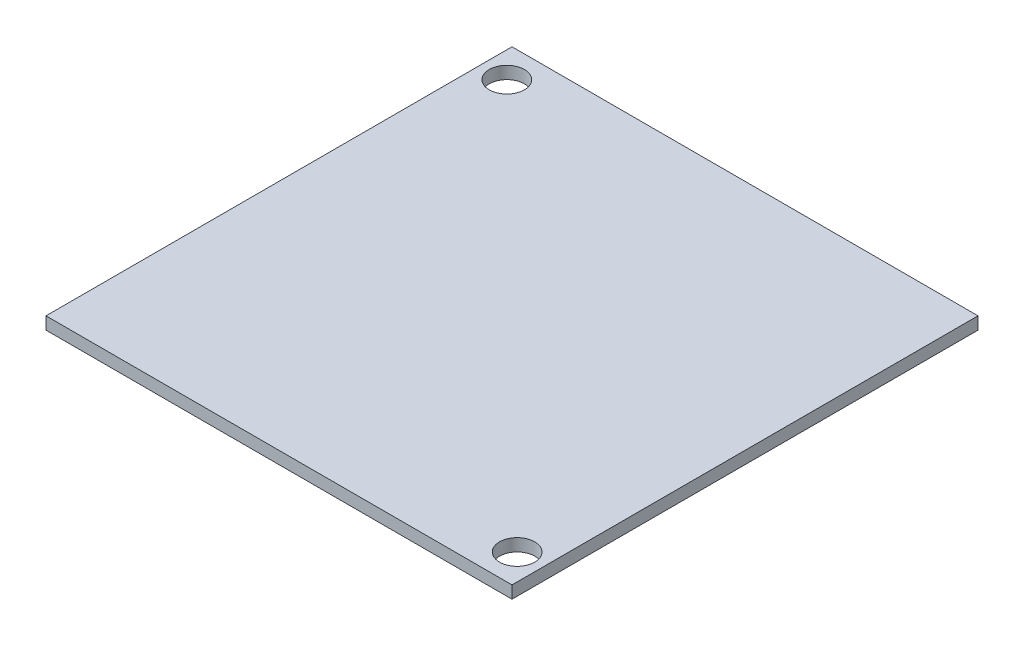
ISO-10303-21;
HEADER;
FILE_DESCRIPTION(('STEP AP214'),'2;1');
FILE_NAME('part.step','',(''),(''),'','','');
FILE_SCHEMA(('AUTOMOTIVE_DESIGN { 1 0 10303 214 1 1 1 1 }'));
ENDSEC;
DATA;
#1=APPLICATION_CONTEXT('core data for automotive mechanical design processes');
#2=APPLICATION_PROTOCOL_DEFINITION('international standard','automotive_design',2000,#1);
#3=PRODUCT_CONTEXT('',#1,'mechanical');
#4=PRODUCT('Part','Part','',(#3));
#5=PRODUCT_RELATED_PRODUCT_CATEGORY('part','',(#4));
#6=PRODUCT_DEFINITION_FORMATION('','',#4);
#7=PRODUCT_DEFINITION_CONTEXT('part definition',#1,'design');
#8=PRODUCT_DEFINITION('design','',#6,#7);
#9=PRODUCT_DEFINITION_SHAPE('','',#8);
#10=(LENGTH_UNIT() NAMED_UNIT(*) SI_UNIT(.MILLI.,.METRE.));
#11=(NAMED_UNIT(*) PLANE_ANGLE_UNIT() SI_UNIT($,.RADIAN.));
#12=(NAMED_UNIT(*) SI_UNIT($,.STERADIAN.) SOLID_ANGLE_UNIT());
#13=UNCERTAINTY_MEASURE_WITH_UNIT(LENGTH_MEASURE(1.E-05),#10,'distance_accuracy_value','');
#14=(GEOMETRIC_REPRESENTATION_CONTEXT(3) GLOBAL_UNCERTAINTY_ASSIGNED_CONTEXT((#13)) GLOBAL_UNIT_ASSIGNED_CONTEXT((#10,
#11,#12)) REPRESENTATION_CONTEXT('',''));
#15=CARTESIAN_POINT('',(0.,0.,0.));
#16=DIRECTION('',(0.,0.,1.));
#17=DIRECTION('',(1.,0.,0.));
#18=AXIS2_PLACEMENT_3D('',#15,#16,#17);
#19=CARTESIAN_POINT('',(-24.7774917250496,1.2,-1.35864833937372));
#20=DIRECTION('',(1.,0.,0.));
#21=DIRECTION('',(0.,0.,-1.));
#22=AXIS2_PLACEMENT_3D('',#19,#20,#21);
#23=PLANE('',#22);
#24=DIRECTION('',(0.,0.,1.));
#25=VECTOR('',#24,1.);
#26=CARTESIAN_POINT('',(-24.7774917250496,0.,-1.35864833937372));
#27=LINE('',#26,#25);
#28=CARTESIAN_POINT('',(-24.7774917250496,0.,-1.35864833937372));
#29=VERTEX_POINT('',#28);
#30=CARTESIAN_POINT('',(-24.7774917250496,0.,43.6413516606263));
#31=VERTEX_POINT('',#30);
#32=EDGE_CURVE('E96',#29,#31,#27,.T.);
#33=ORIENTED_EDGE('',*,*,#32,.T.);
#34=DIRECTION('',(0.,-1.,0.));
#35=VECTOR('',#34,1.);
#36=CARTESIAN_POINT('',(-24.7774917250496,1.2,43.6413516606263));
#37=LINE('',#36,#35);
#38=CARTESIAN_POINT('',(-24.7774917250496,1.2,43.6413516606263));
#39=VERTEX_POINT('',#38);
#40=EDGE_CURVE('E11',#39,#31,#37,.T.);
#41=ORIENTED_EDGE('',*,*,#40,.F.);
#42=DIRECTION('',(0.,0.,1.));
#43=VECTOR('',#42,1.);
#44=CARTESIAN_POINT('',(-24.7774917250496,1.2,-1.35864833937372));
#45=LINE('',#44,#43);
#46=CARTESIAN_POINT('',(-24.7774917250496,1.2,-1.35864833937372));
#47=VERTEX_POINT('',#46);
#48=EDGE_CURVE('E84',#47,#39,#45,.T.);
#49=ORIENTED_EDGE('',*,*,#48,.F.);
#50=DIRECTION('',(0.,-1.,0.));
#51=VECTOR('',#50,1.);
#52=CARTESIAN_POINT('',(-24.7774917250496,1.2,-1.35864833937372));
#53=LINE('',#52,#51);
#54=EDGE_CURVE('E92',#47,#29,#53,.T.);
#55=ORIENTED_EDGE('',*,*,#54,.T.);
#56=EDGE_LOOP('',(#33,#41,#49,#55));
#57=FACE_BOUND('',#56,.T.);
#58=ADVANCED_FACE('F33',(#57),#23,.F.);
#59=CARTESIAN_POINT('',(-24.7774917250496,1.2,43.6413516606263));
#60=DIRECTION('',(0.,0.,-1.));
#61=DIRECTION('',(-1.,0.,0.));
#62=AXIS2_PLACEMENT_3D('',#59,#60,#61);
#63=PLANE('',#62);
#64=DIRECTION('',(1.,0.,0.));
#65=VECTOR('',#64,1.);
#66=CARTESIAN_POINT('',(-24.7774917250496,0.,43.6413516606263));
#67=LINE('',#66,#65);
#68=CARTESIAN_POINT('',(20.2225082749504,0.,43.6413516606263));
#69=VERTEX_POINT('',#68);
#70=EDGE_CURVE('E88',#31,#69,#67,.T.);
#71=ORIENTED_EDGE('',*,*,#70,.T.);
#72=DIRECTION('',(0.,-1.,0.));
#73=VECTOR('',#72,1.);
#74=CARTESIAN_POINT('',(20.2225082749504,1.2,43.6413516606263));
#75=LINE('',#74,#73);
#76=CARTESIAN_POINT('',(20.2225082749504,1.2,43.6413516606263));
#77=VERTEX_POINT('',#76);
#78=EDGE_CURVE('E41',#77,#69,#75,.T.);
#79=ORIENTED_EDGE('',*,*,#78,.F.);
#80=DIRECTION('',(1.,0.,0.));
#81=VECTOR('',#80,1.);
#82=CARTESIAN_POINT('',(-24.7774917250496,1.2,43.6413516606263));
#83=LINE('',#82,#81);
#84=EDGE_CURVE('E79',#39,#77,#83,.T.);
#85=ORIENTED_EDGE('',*,*,#84,.F.);
#86=ORIENTED_EDGE('',*,*,#40,.T.);
#87=EDGE_LOOP('',(#71,#79,#85,#86));
#88=FACE_BOUND('',#87,.T.);
#89=ADVANCED_FACE('F87',(#88),#63,.F.);
#90=CARTESIAN_POINT('',(20.2225082749504,1.2,-1.35864833937372));
#91=DIRECTION('',(-1.,0.,0.));
#92=DIRECTION('',(0.,0.,1.));
#93=AXIS2_PLACEMENT_3D('',#90,#91,#92);
#94=PLANE('',#93);
#95=DIRECTION('',(0.,0.,-1.));
#96=VECTOR('',#95,1.);
#97=CARTESIAN_POINT('',(20.2225082749504,0.,-1.35864833937372));
#98=LINE('',#97,#96);
#99=CARTESIAN_POINT('',(20.2225082749504,0.,-1.35864833937372));
#100=VERTEX_POINT('',#99);
#101=EDGE_CURVE('E66',#69,#100,#98,.T.);
#102=ORIENTED_EDGE('',*,*,#101,.T.);
#103=DIRECTION('',(0.,-1.,0.));
#104=VECTOR('',#103,1.);
#105=CARTESIAN_POINT('',(20.2225082749504,1.2,-1.35864833937372));
#106=LINE('',#105,#104);
#107=CARTESIAN_POINT('',(20.2225082749504,1.2,-1.35864833937372));
#108=VERTEX_POINT('',#107);
#109=EDGE_CURVE('E89',#108,#100,#106,.T.);
#110=ORIENTED_EDGE('',*,*,#109,.F.);
#111=DIRECTION('',(0.,0.,-1.));
#112=VECTOR('',#111,1.);
#113=CARTESIAN_POINT('',(20.2225082749504,1.2,-1.35864833937372));
#114=LINE('',#113,#112);
#115=EDGE_CURVE('E82',#77,#108,#114,.T.);
#116=ORIENTED_EDGE('',*,*,#115,.F.);
#117=ORIENTED_EDGE('',*,*,#78,.T.);
#118=EDGE_LOOP('',(#102,#110,#116,#117));
#119=FACE_BOUND('',#118,.T.);
#120=ADVANCED_FACE('F90',(#119),#94,.F.);
#121=CARTESIAN_POINT('',(-24.7774917250496,1.2,-1.35864833937372));
#122=DIRECTION('',(0.,0.,1.));
#123=DIRECTION('',(1.,0.,0.));
#124=AXIS2_PLACEMENT_3D('',#121,#122,#123);
#125=PLANE('',#124);
#126=DIRECTION('',(-1.,0.,0.));
#127=VECTOR('',#126,1.);
#128=CARTESIAN_POINT('',(-24.7774917250496,0.,-1.35864833937372));
#129=LINE('',#128,#127);
#130=EDGE_CURVE('E72',#100,#29,#129,.T.);
#131=ORIENTED_EDGE('',*,*,#130,.T.);
#132=ORIENTED_EDGE('',*,*,#54,.F.);
#133=DIRECTION('',(-1.,0.,0.));
#134=VECTOR('',#133,1.);
#135=CARTESIAN_POINT('',(-24.7774917250496,1.2,-1.35864833937372));
#136=LINE('',#135,#134);
#137=EDGE_CURVE('E49',#108,#47,#136,.T.);
#138=ORIENTED_EDGE('',*,*,#137,.F.);
#139=ORIENTED_EDGE('',*,*,#109,.T.);
#140=EDGE_LOOP('',(#131,#132,#138,#139));
#141=FACE_BOUND('',#140,.T.);
#142=ADVANCED_FACE('F104',(#141),#125,.F.);
#143=CARTESIAN_POINT('',(0.,1.2,0.));
#144=DIRECTION('',(0.,1.,0.));
#145=DIRECTION('',(0.,0.,1.));
#146=AXIS2_PLACEMENT_3D('',#143,#144,#145);
#147=PLANE('',#146);
#148=CARTESIAN_POINT('',(-22.2774917250496,1.2,1.64135166062628));
#149=DIRECTION('',(0.,1.,0.));
#150=DIRECTION('',(0.,0.,1.));
#151=AXIS2_PLACEMENT_3D('',#148,#149,#150);
#152=CIRCLE('',#151,1.69999999999999);
#153=CARTESIAN_POINT('',(-22.2774917250496,1.2,3.34135166062627));
#154=VERTEX_POINT('',#153);
#155=EDGE_CURVE('E118',#154,#154,#152,.T.);
#156=ORIENTED_EDGE('',*,*,#155,.F.);
#157=EDGE_LOOP('',(#156));
#158=FACE_BOUND('',#157,.T.);
#159=CARTESIAN_POINT('',(17.7225082749504,1.2,40.6413516606263));
#160=DIRECTION('',(0.,1.,0.));
#161=DIRECTION('',(0.,0.,1.));
#162=AXIS2_PLACEMENT_3D('',#159,#160,#161);
#163=CIRCLE('',#162,1.69999999999999);
#164=CARTESIAN_POINT('',(17.7225082749504,1.2,42.3413516606263));
#165=VERTEX_POINT('',#164);
#166=EDGE_CURVE('E112',#165,#165,#163,.T.);
#167=ORIENTED_EDGE('',*,*,#166,.F.);
#168=EDGE_LOOP('',(#167));
#169=FACE_BOUND('',#168,.T.);
#170=ORIENTED_EDGE('',*,*,#48,.T.);
#171=ORIENTED_EDGE('',*,*,#84,.T.);
#172=ORIENTED_EDGE('',*,*,#115,.T.);
#173=ORIENTED_EDGE('',*,*,#137,.T.);
#174=EDGE_LOOP('',(#170,#171,#172,#173));
#175=FACE_BOUND('',#174,.T.);
#176=ADVANCED_FACE('F80',(#158,#169,#175),#147,.T.);
#177=CARTESIAN_POINT('',(0.,0.,0.));
#178=DIRECTION('',(0.,1.,0.));
#179=DIRECTION('',(0.,0.,1.));
#180=AXIS2_PLACEMENT_3D('',#177,#178,#179);
#181=PLANE('',#180);
#182=CARTESIAN_POINT('',(-22.2774917250496,0.,1.64135166062628));
#183=DIRECTION('',(0.,1.,0.));
#184=DIRECTION('',(0.,0.,1.));
#185=AXIS2_PLACEMENT_3D('',#182,#183,#184);
#186=CIRCLE('',#185,1.7);
#187=CARTESIAN_POINT('',(-22.2774917250496,0.,3.34135166062628));
#188=VERTEX_POINT('',#187);
#189=EDGE_CURVE('E115',#188,#188,#186,.T.);
#190=ORIENTED_EDGE('',*,*,#189,.T.);
#191=EDGE_LOOP('',(#190));
#192=FACE_BOUND('',#191,.T.);
#193=CARTESIAN_POINT('',(17.7225082749504,0.,40.6413516606263));
#194=DIRECTION('',(0.,1.,0.));
#195=DIRECTION('',(0.,0.,1.));
#196=AXIS2_PLACEMENT_3D('',#193,#194,#195);
#197=CIRCLE('',#196,1.7);
#198=CARTESIAN_POINT('',(17.7225082749504,0.,42.3413516606263));
#199=VERTEX_POINT('',#198);
#200=EDGE_CURVE('E99',#199,#199,#197,.T.);
#201=ORIENTED_EDGE('',*,*,#200,.T.);
#202=EDGE_LOOP('',(#201));
#203=FACE_BOUND('',#202,.T.);
#204=ORIENTED_EDGE('',*,*,#32,.F.);
#205=ORIENTED_EDGE('',*,*,#130,.F.);
#206=ORIENTED_EDGE('',*,*,#101,.F.);
#207=ORIENTED_EDGE('',*,*,#70,.F.);
#208=EDGE_LOOP('',(#204,#205,#206,#207));
#209=FACE_BOUND('',#208,.T.);
#210=ADVANCED_FACE('F107',(#192,#203,#209),#181,.F.);
#211=CARTESIAN_POINT('',(17.7225082749504,1.2,40.6413516606263));
#212=DIRECTION('',(0.,1.,0.));
#213=DIRECTION('',(0.,0.,1.));
#214=AXIS2_PLACEMENT_3D('',#211,#212,#213);
#215=CYLINDRICAL_SURFACE('',#214,1.69999999999999);
#216=ORIENTED_EDGE('',*,*,#200,.F.);
#217=EDGE_LOOP('',(#216));
#218=FACE_BOUND('',#217,.T.);
#219=ORIENTED_EDGE('',*,*,#166,.T.);
#220=EDGE_LOOP('',(#219));
#221=FACE_BOUND('',#220,.T.);
#222=ADVANCED_FACE('F129',(#218,#221),#215,.F.);
#223=CARTESIAN_POINT('',(-22.2774917250496,1.2,1.64135166062628));
#224=DIRECTION('',(0.,1.,0.));
#225=DIRECTION('',(0.,0.,1.));
#226=AXIS2_PLACEMENT_3D('',#223,#224,#225);
#227=CYLINDRICAL_SURFACE('',#226,1.69999999999999);
#228=ORIENTED_EDGE('',*,*,#189,.F.);
#229=EDGE_LOOP('',(#228));
#230=FACE_BOUND('',#229,.T.);
#231=ORIENTED_EDGE('',*,*,#155,.T.);
#232=EDGE_LOOP('',(#231));
#233=FACE_BOUND('',#232,.T.);
#234=ADVANCED_FACE('F122',(#230,#233),#227,.F.);
#235=CLOSED_SHELL('',(#58,#89,#120,#142,#176,#210,#222,#234));
#236=MANIFOLD_SOLID_BREP('B2',#235);
#237=ADVANCED_BREP_SHAPE_REPRESENTATION('',(#18,#236),#14);
#238=SHAPE_DEFINITION_REPRESENTATION(#9,#237);
ENDSEC;
END-ISO-10303-21;
